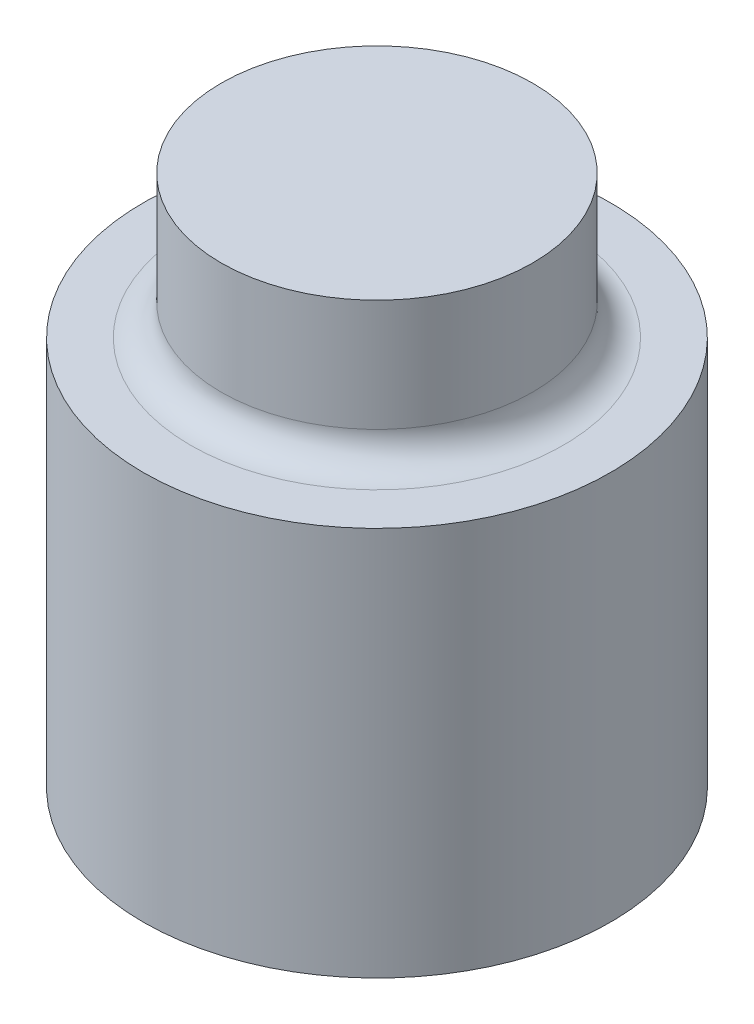
ISO-10303-21;
HEADER;
FILE_DESCRIPTION(('STEP AP214'),'2;1');
FILE_NAME('part.step','',(''),(''),'','','');
FILE_SCHEMA(('AUTOMOTIVE_DESIGN { 1 0 10303 214 1 1 1 1 }'));
ENDSEC;
DATA;
#1=APPLICATION_CONTEXT('core data for automotive mechanical design processes');
#2=APPLICATION_PROTOCOL_DEFINITION('international standard','automotive_design',2000,#1);
#3=PRODUCT_CONTEXT('',#1,'mechanical');
#4=PRODUCT('Part','Part','',(#3));
#5=PRODUCT_RELATED_PRODUCT_CATEGORY('part','',(#4));
#6=PRODUCT_DEFINITION_FORMATION('','',#4);
#7=PRODUCT_DEFINITION_CONTEXT('part definition',#1,'design');
#8=PRODUCT_DEFINITION('design','',#6,#7);
#9=PRODUCT_DEFINITION_SHAPE('','',#8);
#10=(LENGTH_UNIT() NAMED_UNIT(*) SI_UNIT(.MILLI.,.METRE.));
#11=(NAMED_UNIT(*) PLANE_ANGLE_UNIT() SI_UNIT($,.RADIAN.));
#12=(NAMED_UNIT(*) SI_UNIT($,.STERADIAN.) SOLID_ANGLE_UNIT());
#13=UNCERTAINTY_MEASURE_WITH_UNIT(LENGTH_MEASURE(1.E-05),#10,'distance_accuracy_value','');
#14=(GEOMETRIC_REPRESENTATION_CONTEXT(3) GLOBAL_UNCERTAINTY_ASSIGNED_CONTEXT((#13)) GLOBAL_UNIT_ASSIGNED_CONTEXT((#10,
#11,#12)) REPRESENTATION_CONTEXT('',''));
#15=CARTESIAN_POINT('',(0.,0.,0.));
#16=DIRECTION('',(0.,0.,1.));
#17=DIRECTION('',(1.,0.,0.));
#18=AXIS2_PLACEMENT_3D('',#15,#16,#17);
#19=CARTESIAN_POINT('',(0.,127.,0.));
#20=DIRECTION('',(0.,-1.,0.));
#21=DIRECTION('',(0.,0.,-1.));
#22=AXIS2_PLACEMENT_3D('',#19,#20,#21);
#23=CYLINDRICAL_SURFACE('',#22,76.2);
#24=CARTESIAN_POINT('',(0.,127.,0.));
#25=DIRECTION('',(0.,1.,0.));
#26=DIRECTION('',(0.,0.,1.));
#27=AXIS2_PLACEMENT_3D('',#24,#25,#26);
#28=CIRCLE('',#27,76.2);
#29=CARTESIAN_POINT('',(0.,127.,76.2));
#30=VERTEX_POINT('',#29);
#31=EDGE_CURVE('E43',#30,#30,#28,.T.);
#32=ORIENTED_EDGE('',*,*,#31,.F.);
#33=EDGE_LOOP('',(#32));
#34=FACE_BOUND('',#33,.T.);
#35=CARTESIAN_POINT('',(0.,0.,0.));
#36=DIRECTION('',(0.,1.,0.));
#37=DIRECTION('',(0.,0.,1.));
#38=AXIS2_PLACEMENT_3D('',#35,#36,#37);
#39=CIRCLE('',#38,76.2);
#40=CARTESIAN_POINT('',(0.,0.,76.2));
#41=VERTEX_POINT('',#40);
#42=EDGE_CURVE('E47',#41,#41,#39,.T.);
#43=ORIENTED_EDGE('',*,*,#42,.T.);
#44=EDGE_LOOP('',(#43));
#45=FACE_BOUND('',#44,.T.);
#46=ADVANCED_FACE('F32',(#34,#45),#23,.T.);
#47=CARTESIAN_POINT('',(0.,127.,0.));
#48=DIRECTION('',(0.,1.,0.));
#49=DIRECTION('',(0.,0.,1.));
#50=AXIS2_PLACEMENT_3D('',#47,#48,#49);
#51=PLANE('',#50);
#52=CARTESIAN_POINT('',(0.,127.,0.));
#53=DIRECTION('',(0.,1.,0.));
#54=DIRECTION('',(0.,0.,1.));
#55=AXIS2_PLACEMENT_3D('',#52,#53,#54);
#56=CIRCLE('',#55,60.800000066);
#57=CARTESIAN_POINT('',(0.,127.,60.800000066));
#58=VERTEX_POINT('',#57);
#59=EDGE_CURVE('E10',#58,#58,#56,.F.);
#60=ORIENTED_EDGE('',*,*,#59,.T.);
#61=EDGE_LOOP('',(#60));
#62=FACE_BOUND('',#61,.T.);
#63=ORIENTED_EDGE('',*,*,#31,.T.);
#64=EDGE_LOOP('',(#63));
#65=FACE_BOUND('',#64,.T.);
#66=ADVANCED_FACE('F67',(#62,#65),#51,.T.);
#67=CARTESIAN_POINT('',(0.,0.,0.));
#68=DIRECTION('',(0.,1.,0.));
#69=DIRECTION('',(0.,0.,1.));
#70=AXIS2_PLACEMENT_3D('',#67,#68,#69);
#71=PLANE('',#70);
#72=ORIENTED_EDGE('',*,*,#42,.F.);
#73=EDGE_LOOP('',(#72));
#74=FACE_BOUND('',#73,.T.);
#75=ADVANCED_FACE('F60',(#74),#71,.F.);
#76=CARTESIAN_POINT('',(0.,173.482,0.));
#77=DIRECTION('',(0.,-1.,0.));
#78=DIRECTION('',(0.,0.,-1.));
#79=AXIS2_PLACEMENT_3D('',#76,#77,#78);
#80=CYLINDRICAL_SURFACE('',#79,50.8);
#81=CARTESIAN_POINT('',(0.,137.000000066,0.));
#82=DIRECTION('',(0.,1.,0.));
#83=DIRECTION('',(0.,0.,1.));
#84=AXIS2_PLACEMENT_3D('',#81,#82,#83);
#85=CIRCLE('',#84,50.8);
#86=CARTESIAN_POINT('',(0.,137.000000066,50.8));
#87=VERTEX_POINT('',#86);
#88=EDGE_CURVE('E39',#87,#87,#85,.T.);
#89=ORIENTED_EDGE('',*,*,#88,.T.);
#90=EDGE_LOOP('',(#89));
#91=FACE_BOUND('',#90,.T.);
#92=CARTESIAN_POINT('',(0.,173.482,0.));
#93=DIRECTION('',(0.,1.,0.));
#94=DIRECTION('',(0.,0.,1.));
#95=AXIS2_PLACEMENT_3D('',#92,#93,#94);
#96=CIRCLE('',#95,50.8);
#97=CARTESIAN_POINT('',(0.,173.482,50.8));
#98=VERTEX_POINT('',#97);
#99=EDGE_CURVE('E51',#98,#98,#96,.T.);
#100=ORIENTED_EDGE('',*,*,#99,.F.);
#101=EDGE_LOOP('',(#100));
#102=FACE_BOUND('',#101,.T.);
#103=ADVANCED_FACE('F58',(#91,#102),#80,.T.);
#104=CARTESIAN_POINT('',(0.,173.482,0.));
#105=DIRECTION('',(0.,1.,0.));
#106=DIRECTION('',(0.,0.,1.));
#107=AXIS2_PLACEMENT_3D('',#104,#105,#106);
#108=PLANE('',#107);
#109=ORIENTED_EDGE('',*,*,#99,.T.);
#110=EDGE_LOOP('',(#109));
#111=FACE_BOUND('',#110,.T.);
#112=ADVANCED_FACE('F56',(#111),#108,.T.);
#113=CARTESIAN_POINT('',(0.,137.000000066,0.));
#114=DIRECTION('',(0.,1.,0.));
#115=DIRECTION('',(0.,0.,1.));
#116=AXIS2_PLACEMENT_3D('',#113,#114,#115);
#117=TOROIDAL_SURFACE('',#116,60.800000066,10.000000066);
#118=ORIENTED_EDGE('',*,*,#59,.F.);
#119=EDGE_LOOP('',(#118));
#120=FACE_BOUND('',#119,.T.);
#121=ORIENTED_EDGE('',*,*,#88,.F.);
#122=EDGE_LOOP('',(#121));
#123=FACE_BOUND('',#122,.T.);
#124=ADVANCED_FACE('F34',(#120,#123),#117,.F.);
#125=CLOSED_SHELL('',(#46,#66,#75,#103,#112,#124));
#126=MANIFOLD_SOLID_BREP('B2',#125);
#127=ADVANCED_BREP_SHAPE_REPRESENTATION('',(#18,#126),#14);
#128=SHAPE_DEFINITION_REPRESENTATION(#9,#127);
ENDSEC;
END-ISO-10303-21;
